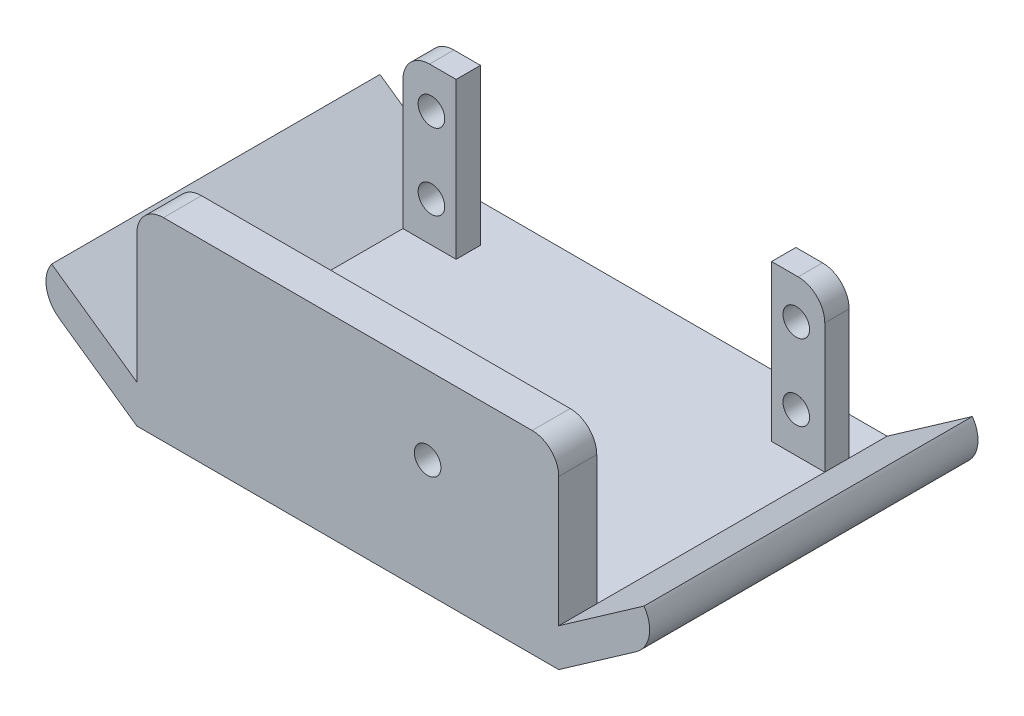
ISO-10303-21;
HEADER;
FILE_DESCRIPTION(('STEP AP214'),'2;1');
FILE_NAME('part.step','',(''),(''),'','','');
FILE_SCHEMA(('AUTOMOTIVE_DESIGN { 1 0 10303 214 1 1 1 1 }'));
ENDSEC;
DATA;
#1=APPLICATION_CONTEXT('core data for automotive mechanical design processes');
#2=APPLICATION_PROTOCOL_DEFINITION('international standard','automotive_design',2000,#1);
#3=PRODUCT_CONTEXT('',#1,'mechanical');
#4=PRODUCT('Part','Part','',(#3));
#5=PRODUCT_RELATED_PRODUCT_CATEGORY('part','',(#4));
#6=PRODUCT_DEFINITION_FORMATION('','',#4);
#7=PRODUCT_DEFINITION_CONTEXT('part definition',#1,'design');
#8=PRODUCT_DEFINITION('design','',#6,#7);
#9=PRODUCT_DEFINITION_SHAPE('','',#8);
#10=(LENGTH_UNIT() NAMED_UNIT(*) SI_UNIT(.MILLI.,.METRE.));
#11=(NAMED_UNIT(*) PLANE_ANGLE_UNIT() SI_UNIT($,.RADIAN.));
#12=(NAMED_UNIT(*) SI_UNIT($,.STERADIAN.) SOLID_ANGLE_UNIT());
#13=UNCERTAINTY_MEASURE_WITH_UNIT(LENGTH_MEASURE(1.E-05),#10,'distance_accuracy_value','');
#14=(GEOMETRIC_REPRESENTATION_CONTEXT(3) GLOBAL_UNCERTAINTY_ASSIGNED_CONTEXT((#13)) GLOBAL_UNIT_ASSIGNED_CONTEXT((#10,
#11,#12)) REPRESENTATION_CONTEXT('',''));
#15=CARTESIAN_POINT('',(0.,0.,0.));
#16=DIRECTION('',(0.,0.,1.));
#17=DIRECTION('',(1.,0.,0.));
#18=AXIS2_PLACEMENT_3D('',#15,#16,#17);
#19=CARTESIAN_POINT('',(55.5,5.,0.));
#20=DIRECTION('',(-1.,0.,0.));
#21=DIRECTION('',(0.,0.,1.));
#22=AXIS2_PLACEMENT_3D('',#19,#20,#21);
#23=PLANE('',#22);
#24=DIRECTION('',(0.,1.,0.));
#25=VECTOR('',#24,1.);
#26=CARTESIAN_POINT('',(55.5,22.,-5.));
#27=LINE('',#26,#25);
#28=CARTESIAN_POINT('',(55.5,5.,-5.));
#29=VERTEX_POINT('',#28);
#30=CARTESIAN_POINT('',(55.5,22.,-5.));
#31=VERTEX_POINT('',#30);
#32=EDGE_CURVE('E226',#29,#31,#27,.T.);
#33=ORIENTED_EDGE('',*,*,#32,.T.);
#34=DIRECTION('',(0.,0.,1.));
#35=VECTOR('',#34,1.);
#36=CARTESIAN_POINT('',(55.5,22.,0.));
#37=LINE('',#36,#35);
#38=CARTESIAN_POINT('',(55.5,22.,0.));
#39=VERTEX_POINT('',#38);
#40=EDGE_CURVE('E282',#31,#39,#37,.T.);
#41=ORIENTED_EDGE('',*,*,#40,.T.);
#42=DIRECTION('',(0.,-1.,0.));
#43=VECTOR('',#42,1.);
#44=CARTESIAN_POINT('',(55.5,0.,0.));
#45=LINE('',#44,#43);
#46=CARTESIAN_POINT('',(55.5,5.,0.));
#47=VERTEX_POINT('',#46);
#48=EDGE_CURVE('E237',#39,#47,#45,.T.);
#49=ORIENTED_EDGE('',*,*,#48,.T.);
#50=DIRECTION('',(0.,0.,-1.));
#51=VECTOR('',#50,1.);
#52=CARTESIAN_POINT('',(55.5,5.,0.));
#53=LINE('',#52,#51);
#54=EDGE_CURVE('E202',#47,#29,#53,.T.);
#55=ORIENTED_EDGE('',*,*,#54,.T.);
#56=EDGE_LOOP('',(#33,#41,#49,#55));
#57=FACE_BOUND('',#56,.T.);
#58=ADVANCED_FACE('F39',(#57),#23,.F.);
#59=CARTESIAN_POINT('',(0.,5.,0.));
#60=DIRECTION('',(1.,0.,0.));
#61=DIRECTION('',(0.,0.,-1.));
#62=AXIS2_PLACEMENT_3D('',#59,#60,#61);
#63=PLANE('',#62);
#64=DIRECTION('',(0.,-1.,0.));
#65=VECTOR('',#64,1.);
#66=CARTESIAN_POINT('',(0.,5.,-5.));
#67=LINE('',#66,#65);
#68=CARTESIAN_POINT('',(0.,22.,-5.));
#69=VERTEX_POINT('',#68);
#70=CARTESIAN_POINT('',(0.,5.,-5.));
#71=VERTEX_POINT('',#70);
#72=EDGE_CURVE('E234',#69,#71,#67,.T.);
#73=ORIENTED_EDGE('',*,*,#72,.T.);
#74=DIRECTION('',(0.,0.,1.));
#75=VECTOR('',#74,1.);
#76=CARTESIAN_POINT('',(0.,5.,0.));
#77=LINE('',#76,#75);
#78=CARTESIAN_POINT('',(0.,5.,0.));
#79=VERTEX_POINT('',#78);
#80=EDGE_CURVE('E260',#71,#79,#77,.T.);
#81=ORIENTED_EDGE('',*,*,#80,.T.);
#82=DIRECTION('',(0.,1.,0.));
#83=VECTOR('',#82,1.);
#84=CARTESIAN_POINT('',(0.,0.,0.));
#85=LINE('',#84,#83);
#86=CARTESIAN_POINT('',(0.,22.,0.));
#87=VERTEX_POINT('',#86);
#88=EDGE_CURVE('E307',#79,#87,#85,.T.);
#89=ORIENTED_EDGE('',*,*,#88,.T.);
#90=DIRECTION('',(0.,0.,1.));
#91=VECTOR('',#90,1.);
#92=CARTESIAN_POINT('',(0.,22.,0.));
#93=LINE('',#92,#91);
#94=EDGE_CURVE('E11',#87,#69,#93,.F.);
#95=ORIENTED_EDGE('',*,*,#94,.T.);
#96=EDGE_LOOP('',(#73,#81,#89,#95));
#97=FACE_BOUND('',#96,.T.);
#98=ADVANCED_FACE('F456',(#97),#63,.F.);
#99=CARTESIAN_POINT('',(0.,25.5,-3.20000000000001));
#100=DIRECTION('',(0.,-1.,0.));
#101=DIRECTION('',(0.,0.,-1.));
#102=AXIS2_PLACEMENT_3D('',#99,#100,#101);
#103=PLANE('',#102);
#104=DIRECTION('',(0.,0.,1.));
#105=VECTOR('',#104,1.);
#106=CARTESIAN_POINT('',(52.,25.5,-3.20000000000001));
#107=LINE('',#106,#105);
#108=CARTESIAN_POINT('',(52.,25.5,0.));
#109=VERTEX_POINT('',#108);
#110=CARTESIAN_POINT('',(52.,25.5,-5.));
#111=VERTEX_POINT('',#110);
#112=EDGE_CURVE('E48',#109,#111,#107,.F.);
#113=ORIENTED_EDGE('',*,*,#112,.T.);
#114=DIRECTION('',(1.,0.,0.));
#115=VECTOR('',#114,1.);
#116=CARTESIAN_POINT('',(55.5,25.5,-5.));
#117=LINE('',#116,#115);
#118=CARTESIAN_POINT('',(3.5,25.5,-5.));
#119=VERTEX_POINT('',#118);
#120=EDGE_CURVE('E299',#119,#111,#117,.T.);
#121=ORIENTED_EDGE('',*,*,#120,.F.);
#122=DIRECTION('',(0.,0.,1.));
#123=VECTOR('',#122,1.);
#124=CARTESIAN_POINT('',(3.5,25.5,-3.20000000000001));
#125=LINE('',#124,#123);
#126=CARTESIAN_POINT('',(3.5,25.5,0.));
#127=VERTEX_POINT('',#126);
#128=EDGE_CURVE('E290',#119,#127,#125,.T.);
#129=ORIENTED_EDGE('',*,*,#128,.T.);
#130=DIRECTION('',(1.,0.,0.));
#131=VECTOR('',#130,1.);
#132=CARTESIAN_POINT('',(55.5,25.5,0.));
#133=LINE('',#132,#131);
#134=EDGE_CURVE('E301',#127,#109,#133,.T.);
#135=ORIENTED_EDGE('',*,*,#134,.T.);
#136=EDGE_LOOP('',(#113,#121,#129,#135));
#137=FACE_BOUND('',#136,.T.);
#138=ADVANCED_FACE('F298',(#137),#103,.F.);
#139=CARTESIAN_POINT('',(55.5,25.5,-38.2));
#140=DIRECTION('',(0.,1.,0.));
#141=DIRECTION('',(0.,0.,1.));
#142=AXIS2_PLACEMENT_3D('',#139,#140,#141);
#143=PLANE('',#142);
#144=DIRECTION('',(1.,0.,0.));
#145=VECTOR('',#144,1.);
#146=CARTESIAN_POINT('',(3.5,25.5,-38.2));
#147=LINE('',#146,#145);
#148=CARTESIAN_POINT('',(3.5,25.5,-38.2));
#149=VERTEX_POINT('',#148);
#150=CARTESIAN_POINT('',(7.,25.5,-38.2));
#151=VERTEX_POINT('',#150);
#152=EDGE_CURVE('E496',#149,#151,#147,.T.);
#153=ORIENTED_EDGE('',*,*,#152,.F.);
#154=DIRECTION('',(0.,0.,1.));
#155=VECTOR('',#154,1.);
#156=CARTESIAN_POINT('',(3.5,25.5,-35.));
#157=LINE('',#156,#155);
#158=CARTESIAN_POINT('',(3.5,25.5,-35.));
#159=VERTEX_POINT('',#158);
#160=EDGE_CURVE('E264',#149,#159,#157,.T.);
#161=ORIENTED_EDGE('',*,*,#160,.T.);
#162=DIRECTION('',(-1.,0.,0.));
#163=VECTOR('',#162,1.);
#164=CARTESIAN_POINT('',(0.,25.5,-35.));
#165=LINE('',#164,#163);
#166=CARTESIAN_POINT('',(7.,25.5,-35.));
#167=VERTEX_POINT('',#166);
#168=EDGE_CURVE('E357',#167,#159,#165,.T.);
#169=ORIENTED_EDGE('',*,*,#168,.F.);
#170=DIRECTION('',(0.,0.,1.));
#171=VECTOR('',#170,1.);
#172=CARTESIAN_POINT('',(7.,25.5,-40.));
#173=LINE('',#172,#171);
#174=EDGE_CURVE('E372',#151,#167,#173,.T.);
#175=ORIENTED_EDGE('',*,*,#174,.F.);
#176=EDGE_LOOP('',(#153,#161,#169,#175));
#177=FACE_BOUND('',#176,.T.);
#178=ADVANCED_FACE('F560',(#177),#143,.T.);
#179=DIRECTION('',(0.,0.,1.));
#180=VECTOR('',#179,1.);
#181=CARTESIAN_POINT('',(55.5,5.,-60.7564078321223));
#182=LINE('',#181,#180);
#183=CARTESIAN_POINT('',(55.5,5.,-38.2));
#184=VERTEX_POINT('',#183);
#185=CARTESIAN_POINT('',(55.5,5.,-35.));
#186=VERTEX_POINT('',#185);
#187=EDGE_CURVE('E206',#184,#186,#182,.T.);
#188=ORIENTED_EDGE('',*,*,#187,.F.);
#189=DIRECTION('',(0.,-1.,0.));
#190=VECTOR('',#189,1.);
#191=CARTESIAN_POINT('',(55.5,22.,-38.2));
#192=LINE('',#191,#190);
#193=CARTESIAN_POINT('',(55.5,22.,-38.2));
#194=VERTEX_POINT('',#193);
#195=EDGE_CURVE('E488',#194,#184,#192,.T.);
#196=ORIENTED_EDGE('',*,*,#195,.F.);
#197=DIRECTION('',(0.,0.,1.));
#198=VECTOR('',#197,1.);
#199=CARTESIAN_POINT('',(55.5,22.,-35.));
#200=LINE('',#199,#198);
#201=CARTESIAN_POINT('',(55.5,22.,-35.));
#202=VERTEX_POINT('',#201);
#203=EDGE_CURVE('E239',#194,#202,#200,.T.);
#204=ORIENTED_EDGE('',*,*,#203,.T.);
#205=DIRECTION('',(0.,1.,0.));
#206=VECTOR('',#205,1.);
#207=CARTESIAN_POINT('',(55.5,25.5,-35.));
#208=LINE('',#207,#206);
#209=EDGE_CURVE('E327',#186,#202,#208,.T.);
#210=ORIENTED_EDGE('',*,*,#209,.F.);
#211=EDGE_LOOP('',(#188,#196,#204,#210));
#212=FACE_BOUND('',#211,.T.);
#213=ADVANCED_FACE('F532',(#212),#23,.F.);
#214=DIRECTION('',(0.,0.,1.));
#215=VECTOR('',#214,1.);
#216=CARTESIAN_POINT('',(0.,22.,-40.));
#217=LINE('',#216,#215);
#218=CARTESIAN_POINT('',(0.,22.,-35.));
#219=VERTEX_POINT('',#218);
#220=CARTESIAN_POINT('',(0.,22.,-38.2));
#221=VERTEX_POINT('',#220);
#222=EDGE_CURVE('E274',#219,#221,#217,.F.);
#223=ORIENTED_EDGE('',*,*,#222,.T.);
#224=DIRECTION('',(0.,1.,0.));
#225=VECTOR('',#224,1.);
#226=CARTESIAN_POINT('',(0.,22.,-38.2));
#227=LINE('',#226,#225);
#228=CARTESIAN_POINT('',(0.,5.,-38.2));
#229=VERTEX_POINT('',#228);
#230=EDGE_CURVE('E55',#229,#221,#227,.T.);
#231=ORIENTED_EDGE('',*,*,#230,.F.);
#232=CARTESIAN_POINT('',(0.,5.,-35.));
#233=VERTEX_POINT('',#232);
#234=EDGE_CURVE('E448',#229,#233,#77,.T.);
#235=ORIENTED_EDGE('',*,*,#234,.T.);
#236=DIRECTION('',(0.,-1.,0.));
#237=VECTOR('',#236,1.);
#238=CARTESIAN_POINT('',(0.,25.5,-35.));
#239=LINE('',#238,#237);
#240=EDGE_CURVE('E353',#219,#233,#239,.T.);
#241=ORIENTED_EDGE('',*,*,#240,.F.);
#242=EDGE_LOOP('',(#223,#231,#235,#241));
#243=FACE_BOUND('',#242,.T.);
#244=ADVANCED_FACE('F556',(#243),#63,.F.);
#245=CARTESIAN_POINT('',(0.,5.,0.));
#246=DIRECTION('',(0.,-1.,0.));
#247=DIRECTION('',(0.,0.,-1.));
#248=AXIS2_PLACEMENT_3D('',#245,#246,#247);
#249=PLANE('',#248);
#250=EDGE_CURVE('E218',#233,#71,#77,.T.);
#251=ORIENTED_EDGE('',*,*,#250,.T.);
#252=DIRECTION('',(1.,0.,0.));
#253=VECTOR('',#252,1.);
#254=CARTESIAN_POINT('',(0.,5.,-5.));
#255=LINE('',#254,#253);
#256=EDGE_CURVE('E214',#71,#29,#255,.T.);
#257=ORIENTED_EDGE('',*,*,#256,.T.);
#258=EDGE_CURVE('E196',#29,#186,#53,.T.);
#259=ORIENTED_EDGE('',*,*,#258,.T.);
#260=DIRECTION('',(1.,0.,0.));
#261=VECTOR('',#260,1.);
#262=CARTESIAN_POINT('',(55.5,5.,-35.));
#263=LINE('',#262,#261);
#264=CARTESIAN_POINT('',(48.5,5.,-35.));
#265=VERTEX_POINT('',#264);
#266=EDGE_CURVE('E331',#265,#186,#263,.T.);
#267=ORIENTED_EDGE('',*,*,#266,.F.);
#268=DIRECTION('',(0.,0.,1.));
#269=VECTOR('',#268,1.);
#270=CARTESIAN_POINT('',(48.5,5.,-40.));
#271=LINE('',#270,#269);
#272=CARTESIAN_POINT('',(48.5,5.,-38.2));
#273=VERTEX_POINT('',#272);
#274=EDGE_CURVE('E346',#273,#265,#271,.T.);
#275=ORIENTED_EDGE('',*,*,#274,.F.);
#276=DIRECTION('',(-1.,0.,0.));
#277=VECTOR('',#276,1.);
#278=CARTESIAN_POINT('',(55.5,5.,-38.2));
#279=LINE('',#278,#277);
#280=EDGE_CURVE('E492',#184,#273,#279,.T.);
#281=ORIENTED_EDGE('',*,*,#280,.F.);
#282=CARTESIAN_POINT('',(55.5,5.,-43.2));
#283=VERTEX_POINT('',#282);
#284=EDGE_CURVE('E384',#283,#184,#182,.T.);
#285=ORIENTED_EDGE('',*,*,#284,.F.);
#286=DIRECTION('',(-1.,0.,0.));
#287=VECTOR('',#286,1.);
#288=CARTESIAN_POINT('',(55.5,5.,-43.2));
#289=LINE('',#288,#287);
#290=CARTESIAN_POINT('',(0.,5.,-43.2));
#291=VERTEX_POINT('',#290);
#292=EDGE_CURVE('E233',#283,#291,#289,.T.);
#293=ORIENTED_EDGE('',*,*,#292,.T.);
#294=EDGE_CURVE('E211',#291,#229,#77,.T.);
#295=ORIENTED_EDGE('',*,*,#294,.T.);
#296=CARTESIAN_POINT('',(7.,5.,-38.2));
#297=VERTEX_POINT('',#296);
#298=EDGE_CURVE('E507',#297,#229,#279,.T.);
#299=ORIENTED_EDGE('',*,*,#298,.F.);
#300=DIRECTION('',(0.,0.,1.));
#301=VECTOR('',#300,1.);
#302=CARTESIAN_POINT('',(7.,5.,-40.));
#303=LINE('',#302,#301);
#304=CARTESIAN_POINT('',(7.,5.,-35.));
#305=VERTEX_POINT('',#304);
#306=EDGE_CURVE('E369',#297,#305,#303,.T.);
#307=ORIENTED_EDGE('',*,*,#306,.T.);
#308=DIRECTION('',(1.,0.,0.));
#309=VECTOR('',#308,1.);
#310=CARTESIAN_POINT('',(0.,5.,-35.));
#311=LINE('',#310,#309);
#312=EDGE_CURVE('E365',#233,#305,#311,.T.);
#313=ORIENTED_EDGE('',*,*,#312,.F.);
#314=EDGE_LOOP('',(#251,#257,#259,#267,#275,#281,#285,#293,#295,#299,#307,#313));
#315=FACE_BOUND('',#314,.T.);
#316=ADVANCED_FACE('F216',(#315),#249,.F.);
#317=CARTESIAN_POINT('',(0.,5.,0.));
#318=DIRECTION('',(0.,0.,-1.));
#319=DIRECTION('',(-1.,0.,0.));
#320=AXIS2_PLACEMENT_3D('',#317,#318,#319);
#321=PLANE('',#320);
#322=CARTESIAN_POINT('',(38.25,15.25,0.));
#323=DIRECTION('',(0.,0.,1.));
#324=DIRECTION('',(1.,0.,0.));
#325=AXIS2_PLACEMENT_3D('',#322,#323,#324);
#326=CIRCLE('',#325,1.75);
#327=CARTESIAN_POINT('',(40.,15.25,0.));
#328=VERTEX_POINT('',#327);
#329=EDGE_CURVE('E462',#328,#328,#326,.T.);
#330=ORIENTED_EDGE('',*,*,#329,.F.);
#331=EDGE_LOOP('',(#330));
#332=FACE_BOUND('',#331,.T.);
#333=ORIENTED_EDGE('',*,*,#48,.F.);
#334=CARTESIAN_POINT('',(52.,22.,0.));
#335=DIRECTION('',(0.,0.,-1.));
#336=DIRECTION('',(-1.,0.,0.));
#337=AXIS2_PLACEMENT_3D('',#334,#335,#336);
#338=CIRCLE('',#337,3.5);
#339=EDGE_CURVE('E287',#39,#109,#338,.F.);
#340=ORIENTED_EDGE('',*,*,#339,.T.);
#341=ORIENTED_EDGE('',*,*,#134,.F.);
#342=CARTESIAN_POINT('',(3.5,22.,0.));
#343=DIRECTION('',(0.,0.,-1.));
#344=DIRECTION('',(-1.,0.,0.));
#345=AXIS2_PLACEMENT_3D('',#342,#343,#344);
#346=CIRCLE('',#345,3.5);
#347=EDGE_CURVE('E63',#127,#87,#346,.F.);
#348=ORIENTED_EDGE('',*,*,#347,.T.);
#349=ORIENTED_EDGE('',*,*,#88,.F.);
#350=DIRECTION('',(-0.819152044288995,0.573576436351041,0.));
#351=VECTOR('',#350,1.);
#352=CARTESIAN_POINT('',(0.,5.,0.));
#353=LINE('',#352,#351);
#354=CARTESIAN_POINT('',(-11.2181745148335,12.8550503602383,0.));
#355=VERTEX_POINT('',#354);
#356=EDGE_CURVE('E409',#79,#355,#353,.T.);
#357=ORIENTED_EDGE('',*,*,#356,.T.);
#358=CARTESIAN_POINT('',(-7.85722108643022,10.5068612528074,0.));
#359=DIRECTION('',(0.,0.,1.));
#360=DIRECTION('',(1.,0.,0.));
#361=AXIS2_PLACEMENT_3D('',#358,#359,#360);
#362=CIRCLE('',#361,4.10000000392109);
#363=CARTESIAN_POINT('',(-10.2088844777185,7.14833786801052,0.));
#364=VERTEX_POINT('',#363);
#365=EDGE_CURVE('E420',#355,#364,#362,.T.);
#366=ORIENTED_EDGE('',*,*,#365,.T.);
#367=DIRECTION('',(0.819152044288995,-0.573576436351041,0.));
#368=VECTOR('',#367,1.);
#369=CARTESIAN_POINT('',(0.,0.,0.));
#370=LINE('',#369,#368);
#371=CARTESIAN_POINT('',(0.,0.,0.));
#372=VERTEX_POINT('',#371);
#373=EDGE_CURVE('E424',#364,#372,#370,.T.);
#374=ORIENTED_EDGE('',*,*,#373,.T.);
#375=DIRECTION('',(1.,0.,0.));
#376=VECTOR('',#375,1.);
#377=CARTESIAN_POINT('',(0.,0.,0.));
#378=LINE('',#377,#376);
#379=CARTESIAN_POINT('',(55.5,0.,0.));
#380=VERTEX_POINT('',#379);
#381=EDGE_CURVE('E249',#372,#380,#378,.T.);
#382=ORIENTED_EDGE('',*,*,#381,.T.);
#383=DIRECTION('',(0.819152044288995,0.573576436351042,0.));
#384=VECTOR('',#383,1.);
#385=CARTESIAN_POINT('',(55.5,0.,0.));
#386=LINE('',#385,#384);
#387=CARTESIAN_POINT('',(65.7088844777185,7.14833786801052,0.));
#388=VERTEX_POINT('',#387);
#389=EDGE_CURVE('E379',#380,#388,#386,.T.);
#390=ORIENTED_EDGE('',*,*,#389,.T.);
#391=CARTESIAN_POINT('',(63.3572210864302,10.5068612528074,0.));
#392=DIRECTION('',(0.,0.,1.));
#393=DIRECTION('',(-1.,0.,0.));
#394=AXIS2_PLACEMENT_3D('',#391,#392,#393);
#395=CIRCLE('',#394,4.10000000392109);
#396=CARTESIAN_POINT('',(66.7181745148335,12.8550503602383,0.));
#397=VERTEX_POINT('',#396);
#398=EDGE_CURVE('E391',#388,#397,#395,.T.);
#399=ORIENTED_EDGE('',*,*,#398,.T.);
#400=DIRECTION('',(-0.819152044288995,-0.573576436351041,0.));
#401=VECTOR('',#400,1.);
#402=CARTESIAN_POINT('',(55.5,5.,0.));
#403=LINE('',#402,#401);
#404=EDGE_CURVE('E395',#397,#47,#403,.T.);
#405=ORIENTED_EDGE('',*,*,#404,.T.);
#406=EDGE_LOOP('',(#333,#340,#341,#348,#349,#357,#366,#374,#382,#390,#399,#405));
#407=FACE_BOUND('',#406,.T.);
#408=ADVANCED_FACE('F458',(#332,#407),#321,.F.);
#409=CARTESIAN_POINT('',(0.,5.,-43.2));
#410=DIRECTION('',(0.,0.,1.));
#411=DIRECTION('',(1.,0.,0.));
#412=AXIS2_PLACEMENT_3D('',#409,#410,#411);
#413=PLANE('',#412);
#414=DIRECTION('',(0.819152044288995,-0.573576436351041,0.));
#415=VECTOR('',#414,1.);
#416=CARTESIAN_POINT('',(0.,5.,-43.2));
#417=LINE('',#416,#415);
#418=CARTESIAN_POINT('',(-11.2181745148335,12.8550503602383,-43.2));
#419=VERTEX_POINT('',#418);
#420=EDGE_CURVE('E250',#419,#291,#417,.T.);
#421=ORIENTED_EDGE('',*,*,#420,.T.);
#422=ORIENTED_EDGE('',*,*,#292,.F.);
#423=DIRECTION('',(0.819152044288995,0.573576436351041,0.));
#424=VECTOR('',#423,1.);
#425=CARTESIAN_POINT('',(55.5,5.,-43.2));
#426=LINE('',#425,#424);
#427=CARTESIAN_POINT('',(66.7181745148335,12.8550503602383,-43.2));
#428=VERTEX_POINT('',#427);
#429=EDGE_CURVE('E383',#283,#428,#426,.T.);
#430=ORIENTED_EDGE('',*,*,#429,.T.);
#431=CARTESIAN_POINT('',(63.3572210864302,10.5068612528074,-43.2));
#432=DIRECTION('',(0.,0.,1.));
#433=DIRECTION('',(1.,0.,0.));
#434=AXIS2_PLACEMENT_3D('',#431,#432,#433);
#435=CIRCLE('',#434,4.10000000392109);
#436=CARTESIAN_POINT('',(65.7088844777185,7.14833786801052,-43.2));
#437=VERTEX_POINT('',#436);
#438=EDGE_CURVE('E380',#428,#437,#435,.F.);
#439=ORIENTED_EDGE('',*,*,#438,.T.);
#440=DIRECTION('',(-0.819152044288995,-0.573576436351042,0.));
#441=VECTOR('',#440,1.);
#442=CARTESIAN_POINT('',(55.5,0.,-43.2));
#443=LINE('',#442,#441);
#444=CARTESIAN_POINT('',(55.5,0.,-43.2));
#445=VERTEX_POINT('',#444);
#446=EDGE_CURVE('E387',#437,#445,#443,.T.);
#447=ORIENTED_EDGE('',*,*,#446,.T.);
#448=DIRECTION('',(-1.,0.,0.));
#449=VECTOR('',#448,1.);
#450=CARTESIAN_POINT('',(0.,0.,-43.2));
#451=LINE('',#450,#449);
#452=CARTESIAN_POINT('',(0.,0.,-43.2));
#453=VERTEX_POINT('',#452);
#454=EDGE_CURVE('E257',#445,#453,#451,.T.);
#455=ORIENTED_EDGE('',*,*,#454,.T.);
#456=DIRECTION('',(-0.819152044288995,0.573576436351041,0.));
#457=VECTOR('',#456,1.);
#458=CARTESIAN_POINT('',(0.,0.,-43.2));
#459=LINE('',#458,#457);
#460=CARTESIAN_POINT('',(-10.2088844777185,7.14833786801052,-43.2));
#461=VERTEX_POINT('',#460);
#462=EDGE_CURVE('E413',#453,#461,#459,.T.);
#463=ORIENTED_EDGE('',*,*,#462,.T.);
#464=CARTESIAN_POINT('',(-7.85722108643022,10.5068612528074,-43.2));
#465=DIRECTION('',(0.,0.,1.));
#466=DIRECTION('',(1.,0.,0.));
#467=AXIS2_PLACEMENT_3D('',#464,#465,#466);
#468=CIRCLE('',#467,4.10000000392109);
#469=EDGE_CURVE('E410',#461,#419,#468,.F.);
#470=ORIENTED_EDGE('',*,*,#469,.T.);
#471=EDGE_LOOP('',(#421,#422,#430,#439,#447,#455,#463,#470));
#472=FACE_BOUND('',#471,.T.);
#473=ADVANCED_FACE('F437',(#472),#413,.F.);
#474=CARTESIAN_POINT('',(0.,0.,0.));
#475=DIRECTION('',(0.,-1.,0.));
#476=DIRECTION('',(0.,0.,-1.));
#477=AXIS2_PLACEMENT_3D('',#474,#475,#476);
#478=PLANE('',#477);
#479=ORIENTED_EDGE('',*,*,#454,.F.);
#480=DIRECTION('',(0.,0.,-1.));
#481=VECTOR('',#480,1.);
#482=CARTESIAN_POINT('',(55.5,0.,0.));
#483=LINE('',#482,#481);
#484=EDGE_CURVE('E254',#380,#445,#483,.T.);
#485=ORIENTED_EDGE('',*,*,#484,.F.);
#486=ORIENTED_EDGE('',*,*,#381,.F.);
#487=DIRECTION('',(0.,0.,1.));
#488=VECTOR('',#487,1.);
#489=CARTESIAN_POINT('',(0.,0.,0.));
#490=LINE('',#489,#488);
#491=EDGE_CURVE('E246',#453,#372,#490,.T.);
#492=ORIENTED_EDGE('',*,*,#491,.F.);
#493=EDGE_LOOP('',(#479,#485,#486,#492));
#494=FACE_BOUND('',#493,.T.);
#495=ADVANCED_FACE('F576',(#494),#478,.T.);
#496=CARTESIAN_POINT('',(48.5,25.5,-38.2));
#497=VERTEX_POINT('',#496);
#498=CARTESIAN_POINT('',(52.,25.5,-38.2));
#499=VERTEX_POINT('',#498);
#500=EDGE_CURVE('E495',#497,#499,#147,.T.);
#501=ORIENTED_EDGE('',*,*,#500,.F.);
#502=DIRECTION('',(0.,0.,1.));
#503=VECTOR('',#502,1.);
#504=CARTESIAN_POINT('',(48.5,25.5,-40.));
#505=LINE('',#504,#503);
#506=CARTESIAN_POINT('',(48.5,25.5,-35.));
#507=VERTEX_POINT('',#506);
#508=EDGE_CURVE('E342',#497,#507,#505,.T.);
#509=ORIENTED_EDGE('',*,*,#508,.T.);
#510=DIRECTION('',(-1.,0.,0.));
#511=VECTOR('',#510,1.);
#512=CARTESIAN_POINT('',(55.5,25.5,-35.));
#513=LINE('',#512,#511);
#514=CARTESIAN_POINT('',(52.,25.5,-35.));
#515=VERTEX_POINT('',#514);
#516=EDGE_CURVE('E339',#515,#507,#513,.T.);
#517=ORIENTED_EDGE('',*,*,#516,.F.);
#518=DIRECTION('',(0.,0.,1.));
#519=VECTOR('',#518,1.);
#520=CARTESIAN_POINT('',(52.,25.5,-40.));
#521=LINE('',#520,#519);
#522=EDGE_CURVE('E267',#515,#499,#521,.F.);
#523=ORIENTED_EDGE('',*,*,#522,.T.);
#524=EDGE_LOOP('',(#501,#509,#517,#523));
#525=FACE_BOUND('',#524,.T.);
#526=ADVANCED_FACE('F527',(#525),#143,.T.);
#527=CARTESIAN_POINT('',(0.,0.,-60.7564078321223));
#528=DIRECTION('',(-0.573576436351041,-0.819152044288995,0.));
#529=DIRECTION('',(0.819152044288995,-0.573576436351041,0.));
#530=AXIS2_PLACEMENT_3D('',#527,#528,#529);
#531=PLANE('',#530);
#532=ORIENTED_EDGE('',*,*,#462,.F.);
#533=ORIENTED_EDGE('',*,*,#491,.T.);
#534=ORIENTED_EDGE('',*,*,#373,.F.);
#535=DIRECTION('',(0.,0.,1.));
#536=VECTOR('',#535,1.);
#537=CARTESIAN_POINT('',(-10.2088844777185,7.14833786801052,-60.7564078321223));
#538=LINE('',#537,#536);
#539=EDGE_CURVE('E414',#461,#364,#538,.T.);
#540=ORIENTED_EDGE('',*,*,#539,.F.);
#541=EDGE_LOOP('',(#532,#533,#534,#540));
#542=FACE_BOUND('',#541,.T.);
#543=ADVANCED_FACE('F575',(#542),#531,.T.);
#544=CARTESIAN_POINT('',(-7.85722108643022,10.5068612528074,-60.7564078321223));
#545=DIRECTION('',(0.,0.,1.));
#546=DIRECTION('',(1.,0.,0.));
#547=AXIS2_PLACEMENT_3D('',#544,#545,#546);
#548=CYLINDRICAL_SURFACE('',#547,4.10000000392109);
#549=ORIENTED_EDGE('',*,*,#469,.F.);
#550=ORIENTED_EDGE('',*,*,#539,.T.);
#551=ORIENTED_EDGE('',*,*,#365,.F.);
#552=DIRECTION('',(0.,0.,1.));
#553=VECTOR('',#552,1.);
#554=CARTESIAN_POINT('',(-11.2181745148335,12.8550503602383,-60.7564078321223));
#555=LINE('',#554,#553);
#556=EDGE_CURVE('E428',#419,#355,#555,.T.);
#557=ORIENTED_EDGE('',*,*,#556,.F.);
#558=EDGE_LOOP('',(#549,#550,#551,#557));
#559=FACE_BOUND('',#558,.T.);
#560=ADVANCED_FACE('F582',(#559),#548,.T.);
#561=CARTESIAN_POINT('',(0.,5.,-60.7564078321223));
#562=DIRECTION('',(0.573576436351041,0.819152044288995,0.));
#563=DIRECTION('',(-0.819152044288995,0.573576436351041,0.));
#564=AXIS2_PLACEMENT_3D('',#561,#562,#563);
#565=PLANE('',#564);
#566=ORIENTED_EDGE('',*,*,#420,.F.);
#567=ORIENTED_EDGE('',*,*,#556,.T.);
#568=ORIENTED_EDGE('',*,*,#356,.F.);
#569=ORIENTED_EDGE('',*,*,#80,.F.);
#570=ORIENTED_EDGE('',*,*,#250,.F.);
#571=ORIENTED_EDGE('',*,*,#234,.F.);
#572=ORIENTED_EDGE('',*,*,#294,.F.);
#573=EDGE_LOOP('',(#566,#567,#568,#569,#570,#571,#572));
#574=FACE_BOUND('',#573,.T.);
#575=ADVANCED_FACE('F442',(#574),#565,.T.);
#576=CARTESIAN_POINT('',(55.5,5.,-60.7564078321223));
#577=DIRECTION('',(-0.573576436351041,0.819152044288995,0.));
#578=DIRECTION('',(-0.819152044288995,-0.573576436351041,0.));
#579=AXIS2_PLACEMENT_3D('',#576,#577,#578);
#580=PLANE('',#579);
#581=ORIENTED_EDGE('',*,*,#429,.F.);
#582=ORIENTED_EDGE('',*,*,#284,.T.);
#583=ORIENTED_EDGE('',*,*,#187,.T.);
#584=ORIENTED_EDGE('',*,*,#258,.F.);
#585=ORIENTED_EDGE('',*,*,#54,.F.);
#586=ORIENTED_EDGE('',*,*,#404,.F.);
#587=DIRECTION('',(0.,0.,1.));
#588=VECTOR('',#587,1.);
#589=CARTESIAN_POINT('',(66.7181745148335,12.8550503602383,-60.7564078321223));
#590=LINE('',#589,#588);
#591=EDGE_CURVE('E401',#428,#397,#590,.T.);
#592=ORIENTED_EDGE('',*,*,#591,.F.);
#593=EDGE_LOOP('',(#581,#582,#583,#584,#585,#586,#592));
#594=FACE_BOUND('',#593,.T.);
#595=ADVANCED_FACE('F199',(#594),#580,.T.);
#596=CARTESIAN_POINT('',(63.3572210864302,10.5068612528074,-60.7564078321223));
#597=DIRECTION('',(0.,0.,1.));
#598=DIRECTION('',(1.,0.,0.));
#599=AXIS2_PLACEMENT_3D('',#596,#597,#598);
#600=CYLINDRICAL_SURFACE('',#599,4.10000000392109);
#601=ORIENTED_EDGE('',*,*,#438,.F.);
#602=ORIENTED_EDGE('',*,*,#591,.T.);
#603=ORIENTED_EDGE('',*,*,#398,.F.);
#604=DIRECTION('',(0.,0.,1.));
#605=VECTOR('',#604,1.);
#606=CARTESIAN_POINT('',(65.7088844777185,7.14833786801052,-60.7564078321223));
#607=LINE('',#606,#605);
#608=EDGE_CURVE('E398',#437,#388,#607,.T.);
#609=ORIENTED_EDGE('',*,*,#608,.F.);
#610=EDGE_LOOP('',(#601,#602,#603,#609));
#611=FACE_BOUND('',#610,.T.);
#612=ADVANCED_FACE('F690',(#611),#600,.T.);
#613=CARTESIAN_POINT('',(55.5,0.,-60.7564078321223));
#614=DIRECTION('',(0.573576436351042,-0.819152044288995,0.));
#615=DIRECTION('',(0.819152044288995,0.573576436351042,0.));
#616=AXIS2_PLACEMENT_3D('',#613,#614,#615);
#617=PLANE('',#616);
#618=ORIENTED_EDGE('',*,*,#446,.F.);
#619=ORIENTED_EDGE('',*,*,#608,.T.);
#620=ORIENTED_EDGE('',*,*,#389,.F.);
#621=ORIENTED_EDGE('',*,*,#484,.T.);
#622=EDGE_LOOP('',(#618,#619,#620,#621));
#623=FACE_BOUND('',#622,.T.);
#624=ADVANCED_FACE('F784',(#623),#617,.T.);
#625=CARTESIAN_POINT('',(7.,25.5,-40.));
#626=DIRECTION('',(1.,0.,0.));
#627=DIRECTION('',(0.,1.,0.));
#628=AXIS2_PLACEMENT_3D('',#625,#626,#627);
#629=PLANE('',#628);
#630=ORIENTED_EDGE('',*,*,#306,.F.);
#631=DIRECTION('',(0.,1.,0.));
#632=VECTOR('',#631,1.);
#633=CARTESIAN_POINT('',(7.,0.,-38.2));
#634=LINE('',#633,#632);
#635=EDGE_CURVE('E375',#297,#151,#634,.T.);
#636=ORIENTED_EDGE('',*,*,#635,.T.);
#637=ORIENTED_EDGE('',*,*,#174,.T.);
#638=DIRECTION('',(0.,1.,0.));
#639=VECTOR('',#638,1.);
#640=CARTESIAN_POINT('',(7.,25.5,-35.));
#641=LINE('',#640,#639);
#642=EDGE_CURVE('E361',#305,#167,#641,.T.);
#643=ORIENTED_EDGE('',*,*,#642,.F.);
#644=EDGE_LOOP('',(#630,#636,#637,#643));
#645=FACE_BOUND('',#644,.T.);
#646=ADVANCED_FACE('F546',(#645),#629,.T.);
#647=CARTESIAN_POINT('',(0.,0.,-35.));
#648=DIRECTION('',(0.,0.,-1.));
#649=DIRECTION('',(1.,0.,0.));
#650=AXIS2_PLACEMENT_3D('',#647,#648,#649);
#651=PLANE('',#650);
#652=CARTESIAN_POINT('',(3.75,10.25,-35.));
#653=DIRECTION('',(0.,0.,1.));
#654=DIRECTION('',(-1.,0.,0.));
#655=AXIS2_PLACEMENT_3D('',#652,#653,#654);
#656=CIRCLE('',#655,1.75);
#657=CARTESIAN_POINT('',(2.,10.25,-35.));
#658=VERTEX_POINT('',#657);
#659=EDGE_CURVE('E312',#658,#658,#656,.T.);
#660=ORIENTED_EDGE('',*,*,#659,.F.);
#661=EDGE_LOOP('',(#660));
#662=FACE_BOUND('',#661,.T.);
#663=CARTESIAN_POINT('',(3.75,20.25,-35.));
#664=DIRECTION('',(0.,0.,1.));
#665=DIRECTION('',(1.,0.,0.));
#666=AXIS2_PLACEMENT_3D('',#663,#664,#665);
#667=CIRCLE('',#666,1.75);
#668=CARTESIAN_POINT('',(5.5,20.25,-35.));
#669=VERTEX_POINT('',#668);
#670=EDGE_CURVE('E316',#669,#669,#667,.T.);
#671=ORIENTED_EDGE('',*,*,#670,.F.);
#672=EDGE_LOOP('',(#671));
#673=FACE_BOUND('',#672,.T.);
#674=ORIENTED_EDGE('',*,*,#168,.T.);
#675=CARTESIAN_POINT('',(3.5,22.,-35.));
#676=DIRECTION('',(0.,0.,-1.));
#677=DIRECTION('',(-1.,0.,0.));
#678=AXIS2_PLACEMENT_3D('',#675,#676,#677);
#679=CIRCLE('',#678,3.5);
#680=EDGE_CURVE('E271',#159,#219,#679,.F.);
#681=ORIENTED_EDGE('',*,*,#680,.T.);
#682=ORIENTED_EDGE('',*,*,#240,.T.);
#683=ORIENTED_EDGE('',*,*,#312,.T.);
#684=ORIENTED_EDGE('',*,*,#642,.T.);
#685=EDGE_LOOP('',(#674,#681,#682,#683,#684));
#686=FACE_BOUND('',#685,.T.);
#687=ADVANCED_FACE('F537',(#662,#673,#686),#651,.F.);
#688=CARTESIAN_POINT('',(48.5,25.5,-40.));
#689=DIRECTION('',(-1.,0.,0.));
#690=DIRECTION('',(0.,-1.,0.));
#691=AXIS2_PLACEMENT_3D('',#688,#689,#690);
#692=PLANE('',#691);
#693=ORIENTED_EDGE('',*,*,#508,.F.);
#694=DIRECTION('',(0.,-1.,0.));
#695=VECTOR('',#694,1.);
#696=CARTESIAN_POINT('',(48.5,0.,-38.2));
#697=LINE('',#696,#695);
#698=EDGE_CURVE('E349',#497,#273,#697,.T.);
#699=ORIENTED_EDGE('',*,*,#698,.T.);
#700=ORIENTED_EDGE('',*,*,#274,.T.);
#701=DIRECTION('',(0.,-1.,0.));
#702=VECTOR('',#701,1.);
#703=CARTESIAN_POINT('',(48.5,25.5,-35.));
#704=LINE('',#703,#702);
#705=EDGE_CURVE('E335',#507,#265,#704,.T.);
#706=ORIENTED_EDGE('',*,*,#705,.F.);
#707=EDGE_LOOP('',(#693,#699,#700,#706));
#708=FACE_BOUND('',#707,.T.);
#709=ADVANCED_FACE('F535',(#708),#692,.T.);
#710=CARTESIAN_POINT('',(0.,0.,-35.));
#711=DIRECTION('',(0.,0.,1.));
#712=DIRECTION('',(-1.,0.,0.));
#713=AXIS2_PLACEMENT_3D('',#710,#711,#712);
#714=PLANE('',#713);
#715=CARTESIAN_POINT('',(51.75,20.25,-35.));
#716=DIRECTION('',(0.,0.,1.));
#717=DIRECTION('',(-1.,0.,0.));
#718=AXIS2_PLACEMENT_3D('',#715,#716,#717);
#719=CIRCLE('',#718,1.75000000000001);
#720=CARTESIAN_POINT('',(50.,20.25,-35.));
#721=VERTEX_POINT('',#720);
#722=EDGE_CURVE('E222',#721,#721,#719,.T.);
#723=ORIENTED_EDGE('',*,*,#722,.F.);
#724=EDGE_LOOP('',(#723));
#725=FACE_BOUND('',#724,.T.);
#726=CARTESIAN_POINT('',(51.75,10.25,-35.));
#727=DIRECTION('',(0.,0.,1.));
#728=DIRECTION('',(1.,0.,0.));
#729=AXIS2_PLACEMENT_3D('',#726,#727,#728);
#730=CIRCLE('',#729,1.75000000000001);
#731=CARTESIAN_POINT('',(53.5,10.25,-35.));
#732=VERTEX_POINT('',#731);
#733=EDGE_CURVE('E317',#732,#732,#730,.T.);
#734=ORIENTED_EDGE('',*,*,#733,.F.);
#735=EDGE_LOOP('',(#734));
#736=FACE_BOUND('',#735,.T.);
#737=ORIENTED_EDGE('',*,*,#209,.T.);
#738=CARTESIAN_POINT('',(52.,22.,-35.));
#739=DIRECTION('',(0.,0.,1.));
#740=DIRECTION('',(1.,0.,0.));
#741=AXIS2_PLACEMENT_3D('',#738,#739,#740);
#742=CIRCLE('',#741,3.5);
#743=EDGE_CURVE('E241',#202,#515,#742,.T.);
#744=ORIENTED_EDGE('',*,*,#743,.T.);
#745=ORIENTED_EDGE('',*,*,#516,.T.);
#746=ORIENTED_EDGE('',*,*,#705,.T.);
#747=ORIENTED_EDGE('',*,*,#266,.T.);
#748=EDGE_LOOP('',(#737,#744,#745,#746,#747));
#749=FACE_BOUND('',#748,.T.);
#750=ADVANCED_FACE('F530',(#725,#736,#749),#714,.T.);
#751=CARTESIAN_POINT('',(51.75,10.25,-35.));
#752=DIRECTION('',(0.,0.,-1.));
#753=DIRECTION('',(-1.,0.,0.));
#754=AXIS2_PLACEMENT_3D('',#751,#752,#753);
#755=CYLINDRICAL_SURFACE('',#754,1.75000000000001);
#756=CARTESIAN_POINT('',(51.75,10.25,-38.2));
#757=DIRECTION('',(0.,0.,1.));
#758=DIRECTION('',(1.,0.,0.));
#759=AXIS2_PLACEMENT_3D('',#756,#757,#758);
#760=CIRCLE('',#759,1.75000000000001);
#761=CARTESIAN_POINT('',(53.5,10.25,-38.2));
#762=VERTEX_POINT('',#761);
#763=EDGE_CURVE('E469',#762,#762,#760,.T.);
#764=ORIENTED_EDGE('',*,*,#763,.F.);
#765=EDGE_LOOP('',(#764));
#766=FACE_BOUND('',#765,.T.);
#767=ORIENTED_EDGE('',*,*,#733,.T.);
#768=EDGE_LOOP('',(#767));
#769=FACE_BOUND('',#768,.T.);
#770=ADVANCED_FACE('F543',(#766,#769),#755,.F.);
#771=CARTESIAN_POINT('',(51.75,20.25,-35.));
#772=DIRECTION('',(0.,0.,-1.));
#773=DIRECTION('',(-1.,0.,0.));
#774=AXIS2_PLACEMENT_3D('',#771,#772,#773);
#775=CYLINDRICAL_SURFACE('',#774,1.75000000000001);
#776=CARTESIAN_POINT('',(51.75,20.25,-38.2));
#777=DIRECTION('',(0.,0.,1.));
#778=DIRECTION('',(1.,0.,0.));
#779=AXIS2_PLACEMENT_3D('',#776,#777,#778);
#780=CIRCLE('',#779,1.75000000000001);
#781=CARTESIAN_POINT('',(53.5,20.25,-38.2));
#782=VERTEX_POINT('',#781);
#783=EDGE_CURVE('E476',#782,#782,#780,.T.);
#784=ORIENTED_EDGE('',*,*,#783,.F.);
#785=EDGE_LOOP('',(#784));
#786=FACE_BOUND('',#785,.T.);
#787=ORIENTED_EDGE('',*,*,#722,.T.);
#788=EDGE_LOOP('',(#787));
#789=FACE_BOUND('',#788,.T.);
#790=ADVANCED_FACE('F626',(#786,#789),#775,.F.);
#791=CARTESIAN_POINT('',(3.75,20.25,-35.));
#792=DIRECTION('',(0.,0.,-1.));
#793=DIRECTION('',(-1.,0.,0.));
#794=AXIS2_PLACEMENT_3D('',#791,#792,#793);
#795=CYLINDRICAL_SURFACE('',#794,1.75);
#796=CARTESIAN_POINT('',(3.75,20.25,-38.2));
#797=DIRECTION('',(0.,0.,1.));
#798=DIRECTION('',(1.,0.,0.));
#799=AXIS2_PLACEMENT_3D('',#796,#797,#798);
#800=CIRCLE('',#799,1.75);
#801=CARTESIAN_POINT('',(5.5,20.25,-38.2));
#802=VERTEX_POINT('',#801);
#803=EDGE_CURVE('E480',#802,#802,#800,.T.);
#804=ORIENTED_EDGE('',*,*,#803,.F.);
#805=EDGE_LOOP('',(#804));
#806=FACE_BOUND('',#805,.T.);
#807=ORIENTED_EDGE('',*,*,#670,.T.);
#808=EDGE_LOOP('',(#807));
#809=FACE_BOUND('',#808,.T.);
#810=ADVANCED_FACE('F622',(#806,#809),#795,.F.);
#811=CARTESIAN_POINT('',(3.75,10.25,-35.));
#812=DIRECTION('',(0.,0.,-1.));
#813=DIRECTION('',(-1.,0.,0.));
#814=AXIS2_PLACEMENT_3D('',#811,#812,#813);
#815=CYLINDRICAL_SURFACE('',#814,1.75);
#816=CARTESIAN_POINT('',(3.75,10.25,-38.2));
#817=DIRECTION('',(0.,0.,1.));
#818=DIRECTION('',(1.,0.,0.));
#819=AXIS2_PLACEMENT_3D('',#816,#817,#818);
#820=CIRCLE('',#819,1.75);
#821=CARTESIAN_POINT('',(5.5,10.25,-38.2));
#822=VERTEX_POINT('',#821);
#823=EDGE_CURVE('E484',#822,#822,#820,.T.);
#824=ORIENTED_EDGE('',*,*,#823,.F.);
#825=EDGE_LOOP('',(#824));
#826=FACE_BOUND('',#825,.T.);
#827=ORIENTED_EDGE('',*,*,#659,.T.);
#828=EDGE_LOOP('',(#827));
#829=FACE_BOUND('',#828,.T.);
#830=ADVANCED_FACE('F603',(#826,#829),#815,.F.);
#831=CARTESIAN_POINT('',(52.,22.,0.));
#832=DIRECTION('',(0.,0.,-1.));
#833=DIRECTION('',(-1.,0.,0.));
#834=AXIS2_PLACEMENT_3D('',#831,#832,#833);
#835=CYLINDRICAL_SURFACE('',#834,3.5);
#836=CARTESIAN_POINT('',(52.,22.,-38.2));
#837=DIRECTION('',(0.,0.,1.));
#838=DIRECTION('',(1.,0.,0.));
#839=AXIS2_PLACEMENT_3D('',#836,#837,#838);
#840=CIRCLE('',#839,3.5);
#841=EDGE_CURVE('E499',#499,#194,#840,.F.);
#842=ORIENTED_EDGE('',*,*,#841,.F.);
#843=ORIENTED_EDGE('',*,*,#522,.F.);
#844=ORIENTED_EDGE('',*,*,#743,.F.);
#845=ORIENTED_EDGE('',*,*,#203,.F.);
#846=EDGE_LOOP('',(#842,#843,#844,#845));
#847=FACE_BOUND('',#846,.T.);
#848=ADVANCED_FACE('F524',(#847),#835,.T.);
#849=CARTESIAN_POINT('',(3.5,22.,-38.2));
#850=DIRECTION('',(0.,0.,-1.));
#851=DIRECTION('',(-1.,0.,0.));
#852=AXIS2_PLACEMENT_3D('',#849,#850,#851);
#853=CYLINDRICAL_SURFACE('',#852,3.5);
#854=CARTESIAN_POINT('',(3.5,22.,-38.2));
#855=DIRECTION('',(0.,0.,1.));
#856=DIRECTION('',(1.,0.,0.));
#857=AXIS2_PLACEMENT_3D('',#854,#855,#856);
#858=CIRCLE('',#857,3.5);
#859=EDGE_CURVE('E491',#221,#149,#858,.F.);
#860=ORIENTED_EDGE('',*,*,#859,.F.);
#861=ORIENTED_EDGE('',*,*,#222,.F.);
#862=ORIENTED_EDGE('',*,*,#680,.F.);
#863=ORIENTED_EDGE('',*,*,#160,.F.);
#864=EDGE_LOOP('',(#860,#861,#862,#863));
#865=FACE_BOUND('',#864,.T.);
#866=ADVANCED_FACE('F602',(#865),#853,.T.);
#867=CARTESIAN_POINT('',(0.,0.,-5.));
#868=DIRECTION('',(0.,0.,-1.));
#869=DIRECTION('',(1.,0.,0.));
#870=AXIS2_PLACEMENT_3D('',#867,#868,#869);
#871=PLANE('',#870);
#872=CARTESIAN_POINT('',(38.25,15.25,-5.));
#873=DIRECTION('',(0.,0.,1.));
#874=DIRECTION('',(1.,0.,0.));
#875=AXIS2_PLACEMENT_3D('',#872,#873,#874);
#876=CIRCLE('',#875,1.75);
#877=CARTESIAN_POINT('',(40.,15.25,-5.));
#878=VERTEX_POINT('',#877);
#879=EDGE_CURVE('E465',#878,#878,#876,.T.);
#880=ORIENTED_EDGE('',*,*,#879,.T.);
#881=EDGE_LOOP('',(#880));
#882=FACE_BOUND('',#881,.T.);
#883=ORIENTED_EDGE('',*,*,#256,.F.);
#884=ORIENTED_EDGE('',*,*,#72,.F.);
#885=CARTESIAN_POINT('',(3.5,22.,-5.));
#886=DIRECTION('',(0.,0.,-1.));
#887=DIRECTION('',(-1.,0.,0.));
#888=AXIS2_PLACEMENT_3D('',#885,#886,#887);
#889=CIRCLE('',#888,3.5);
#890=EDGE_CURVE('E278',#119,#69,#889,.F.);
#891=ORIENTED_EDGE('',*,*,#890,.F.);
#892=ORIENTED_EDGE('',*,*,#120,.T.);
#893=CARTESIAN_POINT('',(52.,22.,-5.));
#894=DIRECTION('',(0.,0.,-1.));
#895=DIRECTION('',(-1.,0.,0.));
#896=AXIS2_PLACEMENT_3D('',#893,#894,#895);
#897=CIRCLE('',#896,3.5);
#898=EDGE_CURVE('E223',#31,#111,#897,.F.);
#899=ORIENTED_EDGE('',*,*,#898,.F.);
#900=ORIENTED_EDGE('',*,*,#32,.F.);
#901=EDGE_LOOP('',(#883,#884,#891,#892,#899,#900));
#902=FACE_BOUND('',#901,.T.);
#903=ADVANCED_FACE('F227',(#882,#902),#871,.T.);
#904=CARTESIAN_POINT('',(52.,22.,0.));
#905=DIRECTION('',(0.,0.,1.));
#906=DIRECTION('',(1.,0.,0.));
#907=AXIS2_PLACEMENT_3D('',#904,#905,#906);
#908=CYLINDRICAL_SURFACE('',#907,3.5);
#909=ORIENTED_EDGE('',*,*,#898,.T.);
#910=ORIENTED_EDGE('',*,*,#112,.F.);
#911=ORIENTED_EDGE('',*,*,#339,.F.);
#912=ORIENTED_EDGE('',*,*,#40,.F.);
#913=EDGE_LOOP('',(#909,#910,#911,#912));
#914=FACE_BOUND('',#913,.T.);
#915=ADVANCED_FACE('F303',(#914),#908,.T.);
#916=CARTESIAN_POINT('',(3.5,22.,-3.20000000000001));
#917=DIRECTION('',(0.,0.,1.));
#918=DIRECTION('',(1.,0.,0.));
#919=AXIS2_PLACEMENT_3D('',#916,#917,#918);
#920=CYLINDRICAL_SURFACE('',#919,3.5);
#921=ORIENTED_EDGE('',*,*,#890,.T.);
#922=ORIENTED_EDGE('',*,*,#94,.F.);
#923=ORIENTED_EDGE('',*,*,#347,.F.);
#924=ORIENTED_EDGE('',*,*,#128,.F.);
#925=EDGE_LOOP('',(#921,#922,#923,#924));
#926=FACE_BOUND('',#925,.T.);
#927=ADVANCED_FACE('F41',(#926),#920,.T.);
#928=CARTESIAN_POINT('',(38.25,15.25,0.));
#929=DIRECTION('',(0.,0.,-1.));
#930=DIRECTION('',(-1.,0.,0.));
#931=AXIS2_PLACEMENT_3D('',#928,#929,#930);
#932=CYLINDRICAL_SURFACE('',#931,1.75);
#933=ORIENTED_EDGE('',*,*,#329,.T.);
#934=EDGE_LOOP('',(#933));
#935=FACE_BOUND('',#934,.T.);
#936=ORIENTED_EDGE('',*,*,#879,.F.);
#937=EDGE_LOOP('',(#936));
#938=FACE_BOUND('',#937,.T.);
#939=ADVANCED_FACE('F611',(#935,#938),#932,.F.);
#940=CARTESIAN_POINT('',(0.,0.,-38.2));
#941=DIRECTION('',(0.,0.,1.));
#942=DIRECTION('',(1.,0.,0.));
#943=AXIS2_PLACEMENT_3D('',#940,#941,#942);
#944=PLANE('',#943);
#945=ORIENTED_EDGE('',*,*,#635,.F.);
#946=ORIENTED_EDGE('',*,*,#298,.T.);
#947=ORIENTED_EDGE('',*,*,#230,.T.);
#948=ORIENTED_EDGE('',*,*,#859,.T.);
#949=ORIENTED_EDGE('',*,*,#152,.T.);
#950=EDGE_LOOP('',(#945,#946,#947,#948,#949));
#951=FACE_BOUND('',#950,.T.);
#952=ORIENTED_EDGE('',*,*,#823,.T.);
#953=EDGE_LOOP('',(#952));
#954=FACE_BOUND('',#953,.T.);
#955=ORIENTED_EDGE('',*,*,#803,.T.);
#956=EDGE_LOOP('',(#955));
#957=FACE_BOUND('',#956,.T.);
#958=ADVANCED_FACE('F649',(#951,#954,#957),#944,.F.);
#959=ORIENTED_EDGE('',*,*,#698,.F.);
#960=ORIENTED_EDGE('',*,*,#500,.T.);
#961=ORIENTED_EDGE('',*,*,#841,.T.);
#962=ORIENTED_EDGE('',*,*,#195,.T.);
#963=ORIENTED_EDGE('',*,*,#280,.T.);
#964=EDGE_LOOP('',(#959,#960,#961,#962,#963));
#965=FACE_BOUND('',#964,.T.);
#966=ORIENTED_EDGE('',*,*,#763,.T.);
#967=EDGE_LOOP('',(#966));
#968=FACE_BOUND('',#967,.T.);
#969=ORIENTED_EDGE('',*,*,#783,.T.);
#970=EDGE_LOOP('',(#969));
#971=FACE_BOUND('',#970,.T.);
#972=ADVANCED_FACE('F516',(#965,#968,#971),#944,.F.);
#973=CLOSED_SHELL('',(#58,#98,#138,#178,#213,#244,#316,#408,#473,#495,#526,#543,#560,#575,#595,
#612,#624,#646,#687,#709,#750,#770,#790,#810,#830,#848,#866,#903,#915,#927,#939,#958,#972));
#974=MANIFOLD_SOLID_BREP('B2',#973);
#975=ADVANCED_BREP_SHAPE_REPRESENTATION('',(#18,#974),#14);
#976=SHAPE_DEFINITION_REPRESENTATION(#9,#975);
ENDSEC;
END-ISO-10303-21;
